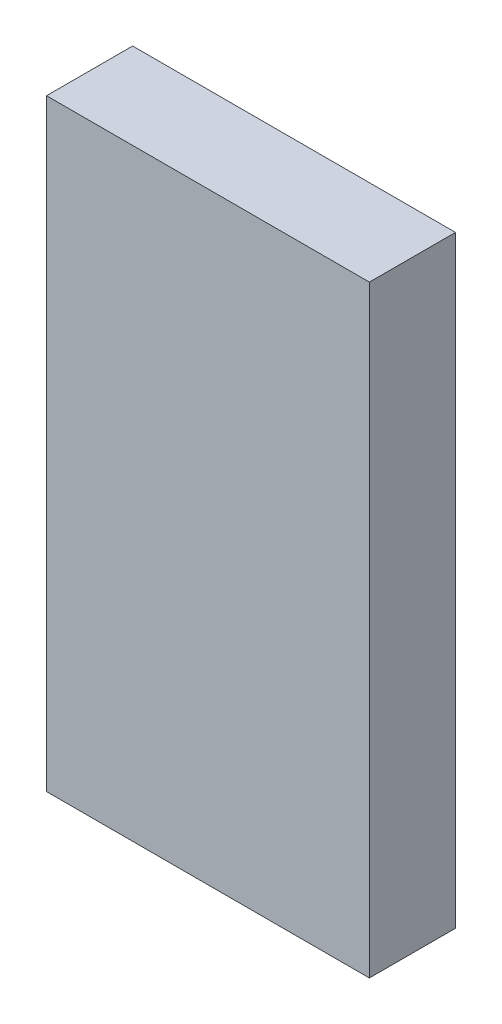
ISO-10303-21;
HEADER;
FILE_DESCRIPTION(('STEP AP214'),'2;1');
FILE_NAME('part.step','',(''),(''),'','','');
FILE_SCHEMA(('AUTOMOTIVE_DESIGN { 1 0 10303 214 1 1 1 1 }'));
ENDSEC;
DATA;
#1=APPLICATION_CONTEXT('core data for automotive mechanical design processes');
#2=APPLICATION_PROTOCOL_DEFINITION('international standard','automotive_design',2000,#1);
#3=PRODUCT_CONTEXT('',#1,'mechanical');
#4=PRODUCT('Part','Part','',(#3));
#5=PRODUCT_RELATED_PRODUCT_CATEGORY('part','',(#4));
#6=PRODUCT_DEFINITION_FORMATION('','',#4);
#7=PRODUCT_DEFINITION_CONTEXT('part definition',#1,'design');
#8=PRODUCT_DEFINITION('design','',#6,#7);
#9=PRODUCT_DEFINITION_SHAPE('','',#8);
#10=(LENGTH_UNIT() NAMED_UNIT(*) SI_UNIT(.MILLI.,.METRE.));
#11=(NAMED_UNIT(*) PLANE_ANGLE_UNIT() SI_UNIT($,.RADIAN.));
#12=(NAMED_UNIT(*) SI_UNIT($,.STERADIAN.) SOLID_ANGLE_UNIT());
#13=UNCERTAINTY_MEASURE_WITH_UNIT(LENGTH_MEASURE(1.E-05),#10,'distance_accuracy_value','');
#14=(GEOMETRIC_REPRESENTATION_CONTEXT(3) GLOBAL_UNCERTAINTY_ASSIGNED_CONTEXT((#13)) GLOBAL_UNIT_ASSIGNED_CONTEXT((#10,
#11,#12)) REPRESENTATION_CONTEXT('',''));
#15=CARTESIAN_POINT('',(0.,0.,0.));
#16=DIRECTION('',(0.,0.,1.));
#17=DIRECTION('',(1.,0.,0.));
#18=AXIS2_PLACEMENT_3D('',#15,#16,#17);
#19=CARTESIAN_POINT('',(0.,0.,209.22401002477));
#20=DIRECTION('',(0.,0.,-1.));
#21=DIRECTION('',(-1.,0.,0.));
#22=AXIS2_PLACEMENT_3D('',#19,#20,#21);
#23=PLANE('',#22);
#24=DIRECTION('',(0.,-1.,0.));
#25=VECTOR('',#24,1.);
#26=CARTESIAN_POINT('',(283.013135804593,1132.38760643089,209.22401002477));
#27=LINE('',#26,#25);
#28=CARTESIAN_POINT('',(283.013135804593,1132.38760643089,209.22401002477));
#29=VERTEX_POINT('',#28);
#30=CARTESIAN_POINT('',(283.013135804593,852.387606430887,209.22401002477));
#31=VERTEX_POINT('',#30);
#32=EDGE_CURVE('E75',#29,#31,#27,.T.);
#33=ORIENTED_EDGE('',*,*,#32,.F.);
#34=DIRECTION('',(-1.,0.,0.));
#35=VECTOR('',#34,1.);
#36=CARTESIAN_POINT('',(433.013135804593,1132.38760643089,209.22401002477));
#37=LINE('',#36,#35);
#38=CARTESIAN_POINT('',(433.013135804593,1132.38760643089,209.22401002477));
#39=VERTEX_POINT('',#38);
#40=EDGE_CURVE('E96',#39,#29,#37,.T.);
#41=ORIENTED_EDGE('',*,*,#40,.F.);
#42=DIRECTION('',(0.,1.,0.));
#43=VECTOR('',#42,1.);
#44=CARTESIAN_POINT('',(433.013135804593,1132.38760643089,209.22401002477));
#45=LINE('',#44,#43);
#46=CARTESIAN_POINT('',(433.013135804593,852.387606430887,209.22401002477));
#47=VERTEX_POINT('',#46);
#48=EDGE_CURVE('E104',#47,#39,#45,.T.);
#49=ORIENTED_EDGE('',*,*,#48,.F.);
#50=DIRECTION('',(1.,0.,0.));
#51=VECTOR('',#50,1.);
#52=CARTESIAN_POINT('',(433.013135804593,852.387606430887,209.22401002477));
#53=LINE('',#52,#51);
#54=EDGE_CURVE('E124',#31,#47,#53,.T.);
#55=ORIENTED_EDGE('',*,*,#54,.F.);
#56=EDGE_LOOP('',(#33,#41,#49,#55));
#57=FACE_BOUND('',#56,.T.);
#58=ADVANCED_FACE('F66',(#57),#23,.T.);
#59=CARTESIAN_POINT('',(0.,0.,249.22401002477));
#60=DIRECTION('',(0.,0.,-1.));
#61=DIRECTION('',(-1.,0.,0.));
#62=AXIS2_PLACEMENT_3D('',#59,#60,#61);
#63=PLANE('',#62);
#64=DIRECTION('',(0.,-1.,0.));
#65=VECTOR('',#64,1.);
#66=CARTESIAN_POINT('',(283.013135804593,1132.38760643089,249.22401002477));
#67=LINE('',#66,#65);
#68=CARTESIAN_POINT('',(283.013135804593,1132.38760643089,249.22401002477));
#69=VERTEX_POINT('',#68);
#70=CARTESIAN_POINT('',(283.013135804593,852.387606430887,249.22401002477));
#71=VERTEX_POINT('',#70);
#72=EDGE_CURVE('E12',#69,#71,#67,.T.);
#73=ORIENTED_EDGE('',*,*,#72,.T.);
#74=DIRECTION('',(1.,0.,0.));
#75=VECTOR('',#74,1.);
#76=CARTESIAN_POINT('',(433.013135804593,852.387606430887,249.22401002477));
#77=LINE('',#76,#75);
#78=CARTESIAN_POINT('',(433.013135804593,852.387606430887,249.22401002477));
#79=VERTEX_POINT('',#78);
#80=EDGE_CURVE('E115',#71,#79,#77,.T.);
#81=ORIENTED_EDGE('',*,*,#80,.T.);
#82=DIRECTION('',(0.,1.,0.));
#83=VECTOR('',#82,1.);
#84=CARTESIAN_POINT('',(433.013135804593,1132.38760643089,249.22401002477));
#85=LINE('',#84,#83);
#86=CARTESIAN_POINT('',(433.013135804593,1132.38760643089,249.22401002477));
#87=VERTEX_POINT('',#86);
#88=EDGE_CURVE('E129',#79,#87,#85,.T.);
#89=ORIENTED_EDGE('',*,*,#88,.T.);
#90=DIRECTION('',(-1.,0.,0.));
#91=VECTOR('',#90,1.);
#92=CARTESIAN_POINT('',(433.013135804593,1132.38760643089,249.22401002477));
#93=LINE('',#92,#91);
#94=EDGE_CURVE('E128',#87,#69,#93,.T.);
#95=ORIENTED_EDGE('',*,*,#94,.T.);
#96=EDGE_LOOP('',(#73,#81,#89,#95));
#97=FACE_BOUND('',#96,.T.);
#98=ADVANCED_FACE('F127',(#97),#63,.F.);
#99=CARTESIAN_POINT('',(433.013135804593,1132.38760643089,249.22401002477));
#100=DIRECTION('',(0.,-1.,0.));
#101=DIRECTION('',(0.,0.,-1.));
#102=AXIS2_PLACEMENT_3D('',#99,#100,#101);
#103=PLANE('',#102);
#104=ORIENTED_EDGE('',*,*,#40,.T.);
#105=DIRECTION('',(0.,0.,-1.));
#106=VECTOR('',#105,1.);
#107=CARTESIAN_POINT('',(283.013135804593,1132.38760643089,249.22401002477));
#108=LINE('',#107,#106);
#109=EDGE_CURVE('E130',#69,#29,#108,.T.);
#110=ORIENTED_EDGE('',*,*,#109,.F.);
#111=ORIENTED_EDGE('',*,*,#94,.F.);
#112=DIRECTION('',(0.,0.,-1.));
#113=VECTOR('',#112,1.);
#114=CARTESIAN_POINT('',(433.013135804593,1132.38760643089,249.22401002477));
#115=LINE('',#114,#113);
#116=EDGE_CURVE('E131',#87,#39,#115,.T.);
#117=ORIENTED_EDGE('',*,*,#116,.T.);
#118=EDGE_LOOP('',(#104,#110,#111,#117));
#119=FACE_BOUND('',#118,.T.);
#120=ADVANCED_FACE('F168',(#119),#103,.F.);
#121=CARTESIAN_POINT('',(433.013135804593,1132.38760643089,249.22401002477));
#122=DIRECTION('',(-1.,0.,0.));
#123=DIRECTION('',(0.,0.,1.));
#124=AXIS2_PLACEMENT_3D('',#121,#122,#123);
#125=PLANE('',#124);
#126=ORIENTED_EDGE('',*,*,#48,.T.);
#127=ORIENTED_EDGE('',*,*,#116,.F.);
#128=ORIENTED_EDGE('',*,*,#88,.F.);
#129=DIRECTION('',(0.,0.,-1.));
#130=VECTOR('',#129,1.);
#131=CARTESIAN_POINT('',(433.013135804593,852.387606430887,249.22401002477));
#132=LINE('',#131,#130);
#133=EDGE_CURVE('E119',#79,#47,#132,.T.);
#134=ORIENTED_EDGE('',*,*,#133,.T.);
#135=EDGE_LOOP('',(#126,#127,#128,#134));
#136=FACE_BOUND('',#135,.T.);
#137=ADVANCED_FACE('F162',(#136),#125,.F.);
#138=CARTESIAN_POINT('',(433.013135804593,852.387606430887,249.22401002477));
#139=DIRECTION('',(0.,1.,0.));
#140=DIRECTION('',(0.,0.,1.));
#141=AXIS2_PLACEMENT_3D('',#138,#139,#140);
#142=PLANE('',#141);
#143=ORIENTED_EDGE('',*,*,#54,.T.);
#144=ORIENTED_EDGE('',*,*,#133,.F.);
#145=ORIENTED_EDGE('',*,*,#80,.F.);
#146=DIRECTION('',(0.,0.,-1.));
#147=VECTOR('',#146,1.);
#148=CARTESIAN_POINT('',(283.013135804593,852.387606430887,249.22401002477));
#149=LINE('',#148,#147);
#150=EDGE_CURVE('E117',#71,#31,#149,.T.);
#151=ORIENTED_EDGE('',*,*,#150,.T.);
#152=EDGE_LOOP('',(#143,#144,#145,#151));
#153=FACE_BOUND('',#152,.T.);
#154=ADVANCED_FACE('F116',(#153),#142,.F.);
#155=CARTESIAN_POINT('',(283.013135804593,1132.38760643089,249.22401002477));
#156=DIRECTION('',(1.,0.,0.));
#157=DIRECTION('',(0.,0.,-1.));
#158=AXIS2_PLACEMENT_3D('',#155,#156,#157);
#159=PLANE('',#158);
#160=ORIENTED_EDGE('',*,*,#32,.T.);
#161=ORIENTED_EDGE('',*,*,#150,.F.);
#162=ORIENTED_EDGE('',*,*,#72,.F.);
#163=ORIENTED_EDGE('',*,*,#109,.T.);
#164=EDGE_LOOP('',(#160,#161,#162,#163));
#165=FACE_BOUND('',#164,.T.);
#166=ADVANCED_FACE('F123',(#165),#159,.F.);
#167=CLOSED_SHELL('',(#58,#98,#120,#137,#154,#166));
#168=MANIFOLD_SOLID_BREP('B2',#167);
#169=ADVANCED_BREP_SHAPE_REPRESENTATION('',(#18,#168),#14);
#170=SHAPE_DEFINITION_REPRESENTATION(#9,#169);
ENDSEC;
END-ISO-10303-21;
